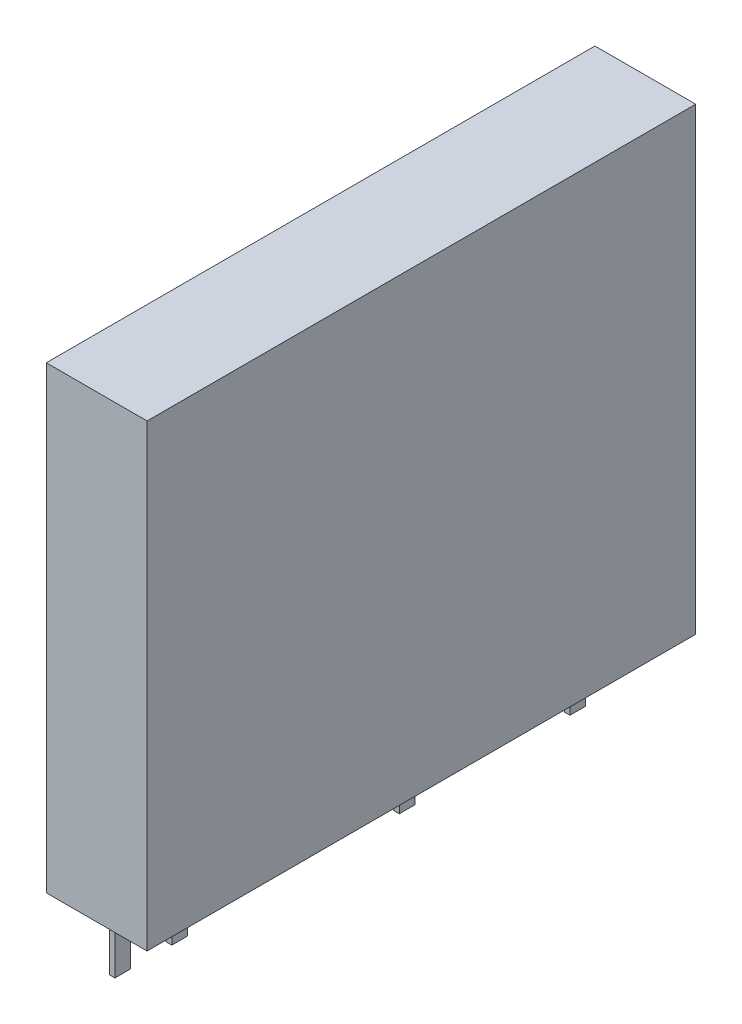
ISO-10303-21;
HEADER;
FILE_DESCRIPTION(('STEP AP214'),'2;1');
FILE_NAME('part.step','',(''),(''),'','','');
FILE_SCHEMA(('AUTOMOTIVE_DESIGN { 1 0 10303 214 1 1 1 1 }'));
ENDSEC;
DATA;
#1=APPLICATION_CONTEXT('core data for automotive mechanical design processes');
#2=APPLICATION_PROTOCOL_DEFINITION('international standard','automotive_design',2000,#1);
#3=PRODUCT_CONTEXT('',#1,'mechanical');
#4=PRODUCT('Part','Part','',(#3));
#5=PRODUCT_RELATED_PRODUCT_CATEGORY('part','',(#4));
#6=PRODUCT_DEFINITION_FORMATION('','',#4);
#7=PRODUCT_DEFINITION_CONTEXT('part definition',#1,'design');
#8=PRODUCT_DEFINITION('design','',#6,#7);
#9=PRODUCT_DEFINITION_SHAPE('','',#8);
#10=(LENGTH_UNIT() NAMED_UNIT(*) SI_UNIT(.MILLI.,.METRE.));
#11=(NAMED_UNIT(*) PLANE_ANGLE_UNIT() SI_UNIT($,.RADIAN.));
#12=(NAMED_UNIT(*) SI_UNIT($,.STERADIAN.) SOLID_ANGLE_UNIT());
#13=UNCERTAINTY_MEASURE_WITH_UNIT(LENGTH_MEASURE(1.E-05),#10,'distance_accuracy_value','');
#14=(GEOMETRIC_REPRESENTATION_CONTEXT(3) GLOBAL_UNCERTAINTY_ASSIGNED_CONTEXT((#13)) GLOBAL_UNIT_ASSIGNED_CONTEXT((#10,
#11,#12)) REPRESENTATION_CONTEXT('',''));
#15=CARTESIAN_POINT('',(0.,0.,0.));
#16=DIRECTION('',(0.,0.,1.));
#17=DIRECTION('',(1.,0.,0.));
#18=AXIS2_PLACEMENT_3D('',#15,#16,#17);
#19=CARTESIAN_POINT('',(4.5,-10.25,12.25));
#20=DIRECTION('',(0.,1.,0.));
#21=DIRECTION('',(0.,0.,1.));
#22=AXIS2_PLACEMENT_3D('',#19,#20,#21);
#23=PLANE('',#22);
#24=DIRECTION('',(0.,0.,-1.));
#25=VECTOR('',#24,1.);
#26=CARTESIAN_POINT('',(1.075,-10.25,-2.19000000000001));
#27=LINE('',#26,#25);
#28=CARTESIAN_POINT('',(1.075,-10.25,-2.19000000000001));
#29=VERTEX_POINT('',#28);
#30=CARTESIAN_POINT('',(1.075,-10.25,-2.89000000000001));
#31=VERTEX_POINT('',#30);
#32=EDGE_CURVE('E191',#29,#31,#27,.T.);
#33=ORIENTED_EDGE('',*,*,#32,.F.);
#34=DIRECTION('',(-1.,0.,0.));
#35=VECTOR('',#34,1.);
#36=CARTESIAN_POINT('',(1.325,-10.25,-2.19000000000001));
#37=LINE('',#36,#35);
#38=CARTESIAN_POINT('',(1.325,-10.25,-2.19000000000001));
#39=VERTEX_POINT('',#38);
#40=EDGE_CURVE('E204',#39,#29,#37,.T.);
#41=ORIENTED_EDGE('',*,*,#40,.F.);
#42=DIRECTION('',(0.,0.,1.));
#43=VECTOR('',#42,1.);
#44=CARTESIAN_POINT('',(1.325,-10.25,-2.19000000000001));
#45=LINE('',#44,#43);
#46=CARTESIAN_POINT('',(1.325,-10.25,-2.89000000000001));
#47=VERTEX_POINT('',#46);
#48=EDGE_CURVE('E213',#47,#39,#45,.T.);
#49=ORIENTED_EDGE('',*,*,#48,.F.);
#50=DIRECTION('',(1.,0.,0.));
#51=VECTOR('',#50,1.);
#52=CARTESIAN_POINT('',(1.325,-10.25,-2.89));
#53=LINE('',#52,#51);
#54=EDGE_CURVE('E194',#31,#47,#53,.T.);
#55=ORIENTED_EDGE('',*,*,#54,.F.);
#56=EDGE_LOOP('',(#33,#41,#49,#55));
#57=FACE_BOUND('',#56,.T.);
#58=DIRECTION('',(0.,0.,-1.));
#59=VECTOR('',#58,1.);
#60=CARTESIAN_POINT('',(1.075,-10.25,10.51));
#61=LINE('',#60,#59);
#62=CARTESIAN_POINT('',(1.075,-10.25,10.51));
#63=VERTEX_POINT('',#62);
#64=CARTESIAN_POINT('',(1.075,-10.25,9.81));
#65=VERTEX_POINT('',#64);
#66=EDGE_CURVE('E262',#63,#65,#61,.T.);
#67=ORIENTED_EDGE('',*,*,#66,.F.);
#68=DIRECTION('',(-1.,0.,0.));
#69=VECTOR('',#68,1.);
#70=CARTESIAN_POINT('',(1.325,-10.25,10.51));
#71=LINE('',#70,#69);
#72=CARTESIAN_POINT('',(1.325,-10.25,10.51));
#73=VERTEX_POINT('',#72);
#74=EDGE_CURVE('E267',#73,#63,#71,.T.);
#75=ORIENTED_EDGE('',*,*,#74,.F.);
#76=DIRECTION('',(0.,0.,1.));
#77=VECTOR('',#76,1.);
#78=CARTESIAN_POINT('',(1.325,-10.25,10.51));
#79=LINE('',#78,#77);
#80=CARTESIAN_POINT('',(1.325,-10.25,9.81));
#81=VERTEX_POINT('',#80);
#82=EDGE_CURVE('E279',#81,#73,#79,.T.);
#83=ORIENTED_EDGE('',*,*,#82,.F.);
#84=DIRECTION('',(1.,0.,0.));
#85=VECTOR('',#84,1.);
#86=CARTESIAN_POINT('',(1.325,-10.25,9.81));
#87=LINE('',#86,#85);
#88=EDGE_CURVE('E276',#65,#81,#87,.T.);
#89=ORIENTED_EDGE('',*,*,#88,.F.);
#90=EDGE_LOOP('',(#67,#75,#83,#89));
#91=FACE_BOUND('',#90,.T.);
#92=DIRECTION('',(0.,0.,-1.));
#93=VECTOR('',#92,1.);
#94=CARTESIAN_POINT('',(0.,-10.25,12.25));
#95=LINE('',#94,#93);
#96=CARTESIAN_POINT('',(0.,-10.25,12.25));
#97=VERTEX_POINT('',#96);
#98=CARTESIAN_POINT('',(0.,-10.25,-12.25));
#99=VERTEX_POINT('',#98);
#100=EDGE_CURVE('E300',#97,#99,#95,.T.);
#101=ORIENTED_EDGE('',*,*,#100,.T.);
#102=DIRECTION('',(-1.,0.,0.));
#103=VECTOR('',#102,1.);
#104=CARTESIAN_POINT('',(4.5,-10.25,-12.25));
#105=LINE('',#104,#103);
#106=CARTESIAN_POINT('',(4.5,-10.25,-12.25));
#107=VERTEX_POINT('',#106);
#108=EDGE_CURVE('E306',#107,#99,#105,.T.);
#109=ORIENTED_EDGE('',*,*,#108,.F.);
#110=DIRECTION('',(0.,0.,-1.));
#111=VECTOR('',#110,1.);
#112=CARTESIAN_POINT('',(4.5,-10.25,12.25));
#113=LINE('',#112,#111);
#114=CARTESIAN_POINT('',(4.5,-10.25,12.25));
#115=VERTEX_POINT('',#114);
#116=EDGE_CURVE('E304',#115,#107,#113,.T.);
#117=ORIENTED_EDGE('',*,*,#116,.F.);
#118=DIRECTION('',(-1.,0.,0.));
#119=VECTOR('',#118,1.);
#120=CARTESIAN_POINT('',(4.5,-10.25,12.25));
#121=LINE('',#120,#119);
#122=EDGE_CURVE('E316',#115,#97,#121,.T.);
#123=ORIENTED_EDGE('',*,*,#122,.T.);
#124=EDGE_LOOP('',(#101,#109,#117,#123));
#125=FACE_BOUND('',#124,.T.);
#126=DIRECTION('',(0.,0.,-1.));
#127=VECTOR('',#126,1.);
#128=CARTESIAN_POINT('',(1.075,-10.25,7.97));
#129=LINE('',#128,#127);
#130=CARTESIAN_POINT('',(1.075,-10.25,7.97));
#131=VERTEX_POINT('',#130);
#132=CARTESIAN_POINT('',(1.075,-10.25,7.27));
#133=VERTEX_POINT('',#132);
#134=EDGE_CURVE('E229',#131,#133,#129,.T.);
#135=ORIENTED_EDGE('',*,*,#134,.F.);
#136=DIRECTION('',(-1.,0.,0.));
#137=VECTOR('',#136,1.);
#138=CARTESIAN_POINT('',(1.325,-10.25,7.97));
#139=LINE('',#138,#137);
#140=CARTESIAN_POINT('',(1.325,-10.25,7.97));
#141=VERTEX_POINT('',#140);
#142=EDGE_CURVE('E234',#141,#131,#139,.T.);
#143=ORIENTED_EDGE('',*,*,#142,.F.);
#144=DIRECTION('',(0.,0.,1.));
#145=VECTOR('',#144,1.);
#146=CARTESIAN_POINT('',(1.325,-10.25,7.97));
#147=LINE('',#146,#145);
#148=CARTESIAN_POINT('',(1.325,-10.25,7.27));
#149=VERTEX_POINT('',#148);
#150=EDGE_CURVE('E246',#149,#141,#147,.T.);
#151=ORIENTED_EDGE('',*,*,#150,.F.);
#152=DIRECTION('',(1.,0.,0.));
#153=VECTOR('',#152,1.);
#154=CARTESIAN_POINT('',(1.325,-10.25,7.27));
#155=LINE('',#154,#153);
#156=EDGE_CURVE('E243',#133,#149,#155,.T.);
#157=ORIENTED_EDGE('',*,*,#156,.F.);
#158=EDGE_LOOP('',(#135,#143,#151,#157));
#159=FACE_BOUND('',#158,.T.);
#160=DIRECTION('',(0.,0.,-1.));
#161=VECTOR('',#160,1.);
#162=CARTESIAN_POINT('',(1.075,-10.25,-9.81));
#163=LINE('',#162,#161);
#164=CARTESIAN_POINT('',(1.075,-10.25,-9.81));
#165=VERTEX_POINT('',#164);
#166=CARTESIAN_POINT('',(1.075,-10.25,-10.51));
#167=VERTEX_POINT('',#166);
#168=EDGE_CURVE('E190',#165,#167,#163,.T.);
#169=ORIENTED_EDGE('',*,*,#168,.F.);
#170=DIRECTION('',(-1.,0.,0.));
#171=VECTOR('',#170,1.);
#172=CARTESIAN_POINT('',(1.325,-10.25,-9.81));
#173=LINE('',#172,#171);
#174=CARTESIAN_POINT('',(1.325,-10.25,-9.81));
#175=VERTEX_POINT('',#174);
#176=EDGE_CURVE('E187',#175,#165,#173,.T.);
#177=ORIENTED_EDGE('',*,*,#176,.F.);
#178=DIRECTION('',(0.,0.,1.));
#179=VECTOR('',#178,1.);
#180=CARTESIAN_POINT('',(1.325,-10.25,-9.81));
#181=LINE('',#180,#179);
#182=CARTESIAN_POINT('',(1.325,-10.25,-10.51));
#183=VERTEX_POINT('',#182);
#184=EDGE_CURVE('E53',#183,#175,#181,.T.);
#185=ORIENTED_EDGE('',*,*,#184,.F.);
#186=DIRECTION('',(1.,0.,0.));
#187=VECTOR('',#186,1.);
#188=CARTESIAN_POINT('',(1.325,-10.25,-10.51));
#189=LINE('',#188,#187);
#190=EDGE_CURVE('E48',#167,#183,#189,.T.);
#191=ORIENTED_EDGE('',*,*,#190,.F.);
#192=EDGE_LOOP('',(#169,#177,#185,#191));
#193=FACE_BOUND('',#192,.T.);
#194=ADVANCED_FACE('F33',(#57,#91,#125,#159,#193),#23,.F.);
#195=CARTESIAN_POINT('',(4.5,-10.25,-12.25));
#196=DIRECTION('',(0.,0.,1.));
#197=DIRECTION('',(1.,0.,0.));
#198=AXIS2_PLACEMENT_3D('',#195,#196,#197);
#199=PLANE('',#198);
#200=DIRECTION('',(0.,1.,0.));
#201=VECTOR('',#200,1.);
#202=CARTESIAN_POINT('',(0.,-10.25,-12.25));
#203=LINE('',#202,#201);
#204=CARTESIAN_POINT('',(0.,10.25,-12.25));
#205=VERTEX_POINT('',#204);
#206=EDGE_CURVE('E295',#99,#205,#203,.T.);
#207=ORIENTED_EDGE('',*,*,#206,.T.);
#208=DIRECTION('',(-1.,0.,0.));
#209=VECTOR('',#208,1.);
#210=CARTESIAN_POINT('',(4.5,10.25,-12.25));
#211=LINE('',#210,#209);
#212=CARTESIAN_POINT('',(4.5,10.25,-12.25));
#213=VERTEX_POINT('',#212);
#214=EDGE_CURVE('E11',#213,#205,#211,.T.);
#215=ORIENTED_EDGE('',*,*,#214,.F.);
#216=DIRECTION('',(0.,1.,0.));
#217=VECTOR('',#216,1.);
#218=CARTESIAN_POINT('',(4.5,-10.25,-12.25));
#219=LINE('',#218,#217);
#220=EDGE_CURVE('E296',#107,#213,#219,.T.);
#221=ORIENTED_EDGE('',*,*,#220,.F.);
#222=ORIENTED_EDGE('',*,*,#108,.T.);
#223=EDGE_LOOP('',(#207,#215,#221,#222));
#224=FACE_BOUND('',#223,.T.);
#225=ADVANCED_FACE('F35',(#224),#199,.F.);
#226=CARTESIAN_POINT('',(4.5,10.25,12.25));
#227=DIRECTION('',(0.,-1.,0.));
#228=DIRECTION('',(0.,0.,-1.));
#229=AXIS2_PLACEMENT_3D('',#226,#227,#228);
#230=PLANE('',#229);
#231=DIRECTION('',(0.,0.,1.));
#232=VECTOR('',#231,1.);
#233=CARTESIAN_POINT('',(0.,10.25,12.25));
#234=LINE('',#233,#232);
#235=CARTESIAN_POINT('',(0.,10.25,12.25));
#236=VERTEX_POINT('',#235);
#237=EDGE_CURVE('E309',#205,#236,#234,.T.);
#238=ORIENTED_EDGE('',*,*,#237,.T.);
#239=DIRECTION('',(-1.,0.,0.));
#240=VECTOR('',#239,1.);
#241=CARTESIAN_POINT('',(4.5,10.25,12.25));
#242=LINE('',#241,#240);
#243=CARTESIAN_POINT('',(4.5,10.25,12.25));
#244=VERTEX_POINT('',#243);
#245=EDGE_CURVE('E41',#244,#236,#242,.T.);
#246=ORIENTED_EDGE('',*,*,#245,.F.);
#247=DIRECTION('',(0.,0.,1.));
#248=VECTOR('',#247,1.);
#249=CARTESIAN_POINT('',(4.5,10.25,12.25));
#250=LINE('',#249,#248);
#251=EDGE_CURVE('E299',#213,#244,#250,.T.);
#252=ORIENTED_EDGE('',*,*,#251,.F.);
#253=ORIENTED_EDGE('',*,*,#214,.T.);
#254=EDGE_LOOP('',(#238,#246,#252,#253));
#255=FACE_BOUND('',#254,.T.);
#256=ADVANCED_FACE('F339',(#255),#230,.F.);
#257=CARTESIAN_POINT('',(4.5,-10.25,12.25));
#258=DIRECTION('',(0.,0.,-1.));
#259=DIRECTION('',(-1.,0.,0.));
#260=AXIS2_PLACEMENT_3D('',#257,#258,#259);
#261=PLANE('',#260);
#262=DIRECTION('',(0.,-1.,0.));
#263=VECTOR('',#262,1.);
#264=CARTESIAN_POINT('',(0.,-10.25,12.25));
#265=LINE('',#264,#263);
#266=EDGE_CURVE('E311',#236,#97,#265,.T.);
#267=ORIENTED_EDGE('',*,*,#266,.T.);
#268=ORIENTED_EDGE('',*,*,#122,.F.);
#269=DIRECTION('',(0.,-1.,0.));
#270=VECTOR('',#269,1.);
#271=CARTESIAN_POINT('',(4.5,-10.25,12.25));
#272=LINE('',#271,#270);
#273=EDGE_CURVE('E302',#244,#115,#272,.T.);
#274=ORIENTED_EDGE('',*,*,#273,.F.);
#275=ORIENTED_EDGE('',*,*,#245,.T.);
#276=EDGE_LOOP('',(#267,#268,#274,#275));
#277=FACE_BOUND('',#276,.T.);
#278=ADVANCED_FACE('F323',(#277),#261,.F.);
#279=CARTESIAN_POINT('',(4.5,0.,0.));
#280=DIRECTION('',(-1.,0.,0.));
#281=DIRECTION('',(0.,0.,1.));
#282=AXIS2_PLACEMENT_3D('',#279,#280,#281);
#283=PLANE('',#282);
#284=ORIENTED_EDGE('',*,*,#220,.T.);
#285=ORIENTED_EDGE('',*,*,#251,.T.);
#286=ORIENTED_EDGE('',*,*,#273,.T.);
#287=ORIENTED_EDGE('',*,*,#116,.T.);
#288=EDGE_LOOP('',(#284,#285,#286,#287));
#289=FACE_BOUND('',#288,.T.);
#290=ADVANCED_FACE('F338',(#289),#283,.F.);
#291=CARTESIAN_POINT('',(0.,0.,0.));
#292=DIRECTION('',(-1.,0.,0.));
#293=DIRECTION('',(0.,0.,1.));
#294=AXIS2_PLACEMENT_3D('',#291,#292,#293);
#295=PLANE('',#294);
#296=ORIENTED_EDGE('',*,*,#206,.F.);
#297=ORIENTED_EDGE('',*,*,#100,.F.);
#298=ORIENTED_EDGE('',*,*,#266,.F.);
#299=ORIENTED_EDGE('',*,*,#237,.F.);
#300=EDGE_LOOP('',(#296,#297,#298,#299));
#301=FACE_BOUND('',#300,.T.);
#302=ADVANCED_FACE('F329',(#301),#295,.T.);
#303=CARTESIAN_POINT('',(1.075,-13.75,10.51));
#304=DIRECTION('',(1.,0.,0.));
#305=DIRECTION('',(0.,0.,-1.));
#306=AXIS2_PLACEMENT_3D('',#303,#304,#305);
#307=PLANE('',#306);
#308=ORIENTED_EDGE('',*,*,#66,.T.);
#309=DIRECTION('',(0.,1.,0.));
#310=VECTOR('',#309,1.);
#311=CARTESIAN_POINT('',(1.075,-13.75,9.81));
#312=LINE('',#311,#310);
#313=CARTESIAN_POINT('',(1.075,-13.75,9.81));
#314=VERTEX_POINT('',#313);
#315=EDGE_CURVE('E292',#314,#65,#312,.T.);
#316=ORIENTED_EDGE('',*,*,#315,.F.);
#317=DIRECTION('',(0.,0.,-1.));
#318=VECTOR('',#317,1.);
#319=CARTESIAN_POINT('',(1.075,-13.75,10.51));
#320=LINE('',#319,#318);
#321=CARTESIAN_POINT('',(1.075,-13.75,10.51));
#322=VERTEX_POINT('',#321);
#323=EDGE_CURVE('E263',#322,#314,#320,.T.);
#324=ORIENTED_EDGE('',*,*,#323,.F.);
#325=DIRECTION('',(0.,1.,0.));
#326=VECTOR('',#325,1.);
#327=CARTESIAN_POINT('',(1.075,-13.75,10.51));
#328=LINE('',#327,#326);
#329=EDGE_CURVE('E273',#322,#63,#328,.T.);
#330=ORIENTED_EDGE('',*,*,#329,.T.);
#331=EDGE_LOOP('',(#308,#316,#324,#330));
#332=FACE_BOUND('',#331,.T.);
#333=ADVANCED_FACE('F355',(#332),#307,.F.);
#334=CARTESIAN_POINT('',(1.325,-13.75,9.81));
#335=DIRECTION('',(0.,0.,1.));
#336=DIRECTION('',(0.,-1.,0.));
#337=AXIS2_PLACEMENT_3D('',#334,#335,#336);
#338=PLANE('',#337);
#339=ORIENTED_EDGE('',*,*,#88,.T.);
#340=DIRECTION('',(0.,1.,0.));
#341=VECTOR('',#340,1.);
#342=CARTESIAN_POINT('',(1.325,-13.75,9.81));
#343=LINE('',#342,#341);
#344=CARTESIAN_POINT('',(1.325,-13.75,9.81));
#345=VERTEX_POINT('',#344);
#346=EDGE_CURVE('E289',#345,#81,#343,.T.);
#347=ORIENTED_EDGE('',*,*,#346,.F.);
#348=DIRECTION('',(1.,0.,0.));
#349=VECTOR('',#348,1.);
#350=CARTESIAN_POINT('',(1.325,-13.75,9.81));
#351=LINE('',#350,#349);
#352=EDGE_CURVE('E266',#314,#345,#351,.T.);
#353=ORIENTED_EDGE('',*,*,#352,.F.);
#354=ORIENTED_EDGE('',*,*,#315,.T.);
#355=EDGE_LOOP('',(#339,#347,#353,#354));
#356=FACE_BOUND('',#355,.T.);
#357=ADVANCED_FACE('F360',(#356),#338,.F.);
#358=CARTESIAN_POINT('',(1.325,-13.75,10.51));
#359=DIRECTION('',(-1.,0.,0.));
#360=DIRECTION('',(0.,0.,1.));
#361=AXIS2_PLACEMENT_3D('',#358,#359,#360);
#362=PLANE('',#361);
#363=ORIENTED_EDGE('',*,*,#82,.T.);
#364=DIRECTION('',(0.,1.,0.));
#365=VECTOR('',#364,1.);
#366=CARTESIAN_POINT('',(1.325,-13.75,10.51));
#367=LINE('',#366,#365);
#368=CARTESIAN_POINT('',(1.325,-13.75,10.51));
#369=VERTEX_POINT('',#368);
#370=EDGE_CURVE('E286',#369,#73,#367,.T.);
#371=ORIENTED_EDGE('',*,*,#370,.F.);
#372=DIRECTION('',(0.,0.,1.));
#373=VECTOR('',#372,1.);
#374=CARTESIAN_POINT('',(1.325,-13.75,10.51));
#375=LINE('',#374,#373);
#376=EDGE_CURVE('E269',#345,#369,#375,.T.);
#377=ORIENTED_EDGE('',*,*,#376,.F.);
#378=ORIENTED_EDGE('',*,*,#346,.T.);
#379=EDGE_LOOP('',(#363,#371,#377,#378));
#380=FACE_BOUND('',#379,.T.);
#381=ADVANCED_FACE('F364',(#380),#362,.F.);
#382=CARTESIAN_POINT('',(1.325,-13.75,10.51));
#383=DIRECTION('',(0.,0.,-1.));
#384=DIRECTION('',(-1.,0.,0.));
#385=AXIS2_PLACEMENT_3D('',#382,#383,#384);
#386=PLANE('',#385);
#387=ORIENTED_EDGE('',*,*,#74,.T.);
#388=ORIENTED_EDGE('',*,*,#329,.F.);
#389=DIRECTION('',(-1.,0.,0.));
#390=VECTOR('',#389,1.);
#391=CARTESIAN_POINT('',(1.325,-13.75,10.51));
#392=LINE('',#391,#390);
#393=EDGE_CURVE('E271',#369,#322,#392,.T.);
#394=ORIENTED_EDGE('',*,*,#393,.F.);
#395=ORIENTED_EDGE('',*,*,#370,.T.);
#396=EDGE_LOOP('',(#387,#388,#394,#395));
#397=FACE_BOUND('',#396,.T.);
#398=ADVANCED_FACE('F368',(#397),#386,.F.);
#399=CARTESIAN_POINT('',(0.,-13.75,0.));
#400=DIRECTION('',(0.,1.,0.));
#401=DIRECTION('',(0.,0.,1.));
#402=AXIS2_PLACEMENT_3D('',#399,#400,#401);
#403=PLANE('',#402);
#404=ORIENTED_EDGE('',*,*,#323,.T.);
#405=ORIENTED_EDGE('',*,*,#352,.T.);
#406=ORIENTED_EDGE('',*,*,#376,.T.);
#407=ORIENTED_EDGE('',*,*,#393,.T.);
#408=EDGE_LOOP('',(#404,#405,#406,#407));
#409=FACE_BOUND('',#408,.T.);
#410=ADVANCED_FACE('F372',(#409),#403,.F.);
#411=CARTESIAN_POINT('',(1.075,-13.75,7.97));
#412=DIRECTION('',(1.,0.,0.));
#413=DIRECTION('',(0.,0.,-1.));
#414=AXIS2_PLACEMENT_3D('',#411,#412,#413);
#415=PLANE('',#414);
#416=ORIENTED_EDGE('',*,*,#134,.T.);
#417=DIRECTION('',(0.,1.,0.));
#418=VECTOR('',#417,1.);
#419=CARTESIAN_POINT('',(1.075,-13.75,7.27));
#420=LINE('',#419,#418);
#421=CARTESIAN_POINT('',(1.075,-13.75,7.27));
#422=VERTEX_POINT('',#421);
#423=EDGE_CURVE('E259',#422,#133,#420,.T.);
#424=ORIENTED_EDGE('',*,*,#423,.F.);
#425=DIRECTION('',(0.,0.,-1.));
#426=VECTOR('',#425,1.);
#427=CARTESIAN_POINT('',(1.075,-13.75,7.97));
#428=LINE('',#427,#426);
#429=CARTESIAN_POINT('',(1.075,-13.75,7.97));
#430=VERTEX_POINT('',#429);
#431=EDGE_CURVE('E230',#430,#422,#428,.T.);
#432=ORIENTED_EDGE('',*,*,#431,.F.);
#433=DIRECTION('',(0.,1.,0.));
#434=VECTOR('',#433,1.);
#435=CARTESIAN_POINT('',(1.075,-13.75,7.97));
#436=LINE('',#435,#434);
#437=EDGE_CURVE('E240',#430,#131,#436,.T.);
#438=ORIENTED_EDGE('',*,*,#437,.T.);
#439=EDGE_LOOP('',(#416,#424,#432,#438));
#440=FACE_BOUND('',#439,.T.);
#441=ADVANCED_FACE('F376',(#440),#415,.F.);
#442=CARTESIAN_POINT('',(1.325,-13.75,7.27));
#443=DIRECTION('',(0.,0.,1.));
#444=DIRECTION('',(0.,-1.,0.));
#445=AXIS2_PLACEMENT_3D('',#442,#443,#444);
#446=PLANE('',#445);
#447=ORIENTED_EDGE('',*,*,#156,.T.);
#448=DIRECTION('',(0.,1.,0.));
#449=VECTOR('',#448,1.);
#450=CARTESIAN_POINT('',(1.325,-13.75,7.27));
#451=LINE('',#450,#449);
#452=CARTESIAN_POINT('',(1.325,-13.75,7.27));
#453=VERTEX_POINT('',#452);
#454=EDGE_CURVE('E256',#453,#149,#451,.T.);
#455=ORIENTED_EDGE('',*,*,#454,.F.);
#456=DIRECTION('',(1.,0.,0.));
#457=VECTOR('',#456,1.);
#458=CARTESIAN_POINT('',(1.325,-13.75,7.27));
#459=LINE('',#458,#457);
#460=EDGE_CURVE('E233',#422,#453,#459,.T.);
#461=ORIENTED_EDGE('',*,*,#460,.F.);
#462=ORIENTED_EDGE('',*,*,#423,.T.);
#463=EDGE_LOOP('',(#447,#455,#461,#462));
#464=FACE_BOUND('',#463,.T.);
#465=ADVANCED_FACE('F380',(#464),#446,.F.);
#466=CARTESIAN_POINT('',(1.325,-13.75,7.97));
#467=DIRECTION('',(-1.,0.,0.));
#468=DIRECTION('',(0.,0.,1.));
#469=AXIS2_PLACEMENT_3D('',#466,#467,#468);
#470=PLANE('',#469);
#471=ORIENTED_EDGE('',*,*,#150,.T.);
#472=DIRECTION('',(0.,1.,0.));
#473=VECTOR('',#472,1.);
#474=CARTESIAN_POINT('',(1.325,-13.75,7.97));
#475=LINE('',#474,#473);
#476=CARTESIAN_POINT('',(1.325,-13.75,7.97));
#477=VERTEX_POINT('',#476);
#478=EDGE_CURVE('E253',#477,#141,#475,.T.);
#479=ORIENTED_EDGE('',*,*,#478,.F.);
#480=DIRECTION('',(0.,0.,1.));
#481=VECTOR('',#480,1.);
#482=CARTESIAN_POINT('',(1.325,-13.75,7.97));
#483=LINE('',#482,#481);
#484=EDGE_CURVE('E236',#453,#477,#483,.T.);
#485=ORIENTED_EDGE('',*,*,#484,.F.);
#486=ORIENTED_EDGE('',*,*,#454,.T.);
#487=EDGE_LOOP('',(#471,#479,#485,#486));
#488=FACE_BOUND('',#487,.T.);
#489=ADVANCED_FACE('F384',(#488),#470,.F.);
#490=CARTESIAN_POINT('',(1.325,-13.75,7.97));
#491=DIRECTION('',(0.,0.,-1.));
#492=DIRECTION('',(-1.,0.,0.));
#493=AXIS2_PLACEMENT_3D('',#490,#491,#492);
#494=PLANE('',#493);
#495=ORIENTED_EDGE('',*,*,#142,.T.);
#496=ORIENTED_EDGE('',*,*,#437,.F.);
#497=DIRECTION('',(-1.,0.,0.));
#498=VECTOR('',#497,1.);
#499=CARTESIAN_POINT('',(1.325,-13.75,7.97));
#500=LINE('',#499,#498);
#501=EDGE_CURVE('E238',#477,#430,#500,.T.);
#502=ORIENTED_EDGE('',*,*,#501,.F.);
#503=ORIENTED_EDGE('',*,*,#478,.T.);
#504=EDGE_LOOP('',(#495,#496,#502,#503));
#505=FACE_BOUND('',#504,.T.);
#506=ADVANCED_FACE('F388',(#505),#494,.F.);
#507=CARTESIAN_POINT('',(0.,-13.75,0.));
#508=DIRECTION('',(0.,1.,0.));
#509=DIRECTION('',(0.,0.,1.));
#510=AXIS2_PLACEMENT_3D('',#507,#508,#509);
#511=PLANE('',#510);
#512=ORIENTED_EDGE('',*,*,#431,.T.);
#513=ORIENTED_EDGE('',*,*,#460,.T.);
#514=ORIENTED_EDGE('',*,*,#484,.T.);
#515=ORIENTED_EDGE('',*,*,#501,.T.);
#516=EDGE_LOOP('',(#512,#513,#514,#515));
#517=FACE_BOUND('',#516,.T.);
#518=ADVANCED_FACE('F392',(#517),#511,.F.);
#519=CARTESIAN_POINT('',(1.075,-13.75,-2.19000000000001));
#520=DIRECTION('',(1.,0.,0.));
#521=DIRECTION('',(0.,0.,-1.));
#522=AXIS2_PLACEMENT_3D('',#519,#520,#521);
#523=PLANE('',#522);
#524=ORIENTED_EDGE('',*,*,#32,.T.);
#525=DIRECTION('',(0.,1.,0.));
#526=VECTOR('',#525,1.);
#527=CARTESIAN_POINT('',(1.075,-13.75,-2.89000000000001));
#528=LINE('',#527,#526);
#529=CARTESIAN_POINT('',(1.075,-13.75,-2.89000000000001));
#530=VERTEX_POINT('',#529);
#531=EDGE_CURVE('E226',#530,#31,#528,.T.);
#532=ORIENTED_EDGE('',*,*,#531,.F.);
#533=DIRECTION('',(0.,0.,-1.));
#534=VECTOR('',#533,1.);
#535=CARTESIAN_POINT('',(1.075,-13.75,-2.19000000000001));
#536=LINE('',#535,#534);
#537=CARTESIAN_POINT('',(1.075,-13.75,-2.19000000000001));
#538=VERTEX_POINT('',#537);
#539=EDGE_CURVE('E200',#538,#530,#536,.T.);
#540=ORIENTED_EDGE('',*,*,#539,.F.);
#541=DIRECTION('',(0.,1.,0.));
#542=VECTOR('',#541,1.);
#543=CARTESIAN_POINT('',(1.075,-13.75,-2.19000000000001));
#544=LINE('',#543,#542);
#545=EDGE_CURVE('E209',#538,#29,#544,.T.);
#546=ORIENTED_EDGE('',*,*,#545,.T.);
#547=EDGE_LOOP('',(#524,#532,#540,#546));
#548=FACE_BOUND('',#547,.T.);
#549=ADVANCED_FACE('F396',(#548),#523,.F.);
#550=CARTESIAN_POINT('',(1.325,-13.75,-2.89000000000001));
#551=DIRECTION('',(0.,0.,1.));
#552=DIRECTION('',(1.,0.,0.));
#553=AXIS2_PLACEMENT_3D('',#550,#551,#552);
#554=PLANE('',#553);
#555=ORIENTED_EDGE('',*,*,#54,.T.);
#556=DIRECTION('',(0.,1.,0.));
#557=VECTOR('',#556,1.);
#558=CARTESIAN_POINT('',(1.325,-13.75,-2.89000000000001));
#559=LINE('',#558,#557);
#560=CARTESIAN_POINT('',(1.325,-13.75,-2.89000000000001));
#561=VERTEX_POINT('',#560);
#562=EDGE_CURVE('E223',#561,#47,#559,.T.);
#563=ORIENTED_EDGE('',*,*,#562,.F.);
#564=DIRECTION('',(1.,0.,0.));
#565=VECTOR('',#564,1.);
#566=CARTESIAN_POINT('',(1.325,-13.75,-2.89000000000001));
#567=LINE('',#566,#565);
#568=EDGE_CURVE('E203',#530,#561,#567,.T.);
#569=ORIENTED_EDGE('',*,*,#568,.F.);
#570=ORIENTED_EDGE('',*,*,#531,.T.);
#571=EDGE_LOOP('',(#555,#563,#569,#570));
#572=FACE_BOUND('',#571,.T.);
#573=ADVANCED_FACE('F400',(#572),#554,.F.);
#574=CARTESIAN_POINT('',(1.325,-13.75,-2.19000000000001));
#575=DIRECTION('',(-1.,0.,0.));
#576=DIRECTION('',(0.,0.,1.));
#577=AXIS2_PLACEMENT_3D('',#574,#575,#576);
#578=PLANE('',#577);
#579=ORIENTED_EDGE('',*,*,#48,.T.);
#580=DIRECTION('',(0.,1.,0.));
#581=VECTOR('',#580,1.);
#582=CARTESIAN_POINT('',(1.325,-13.75,-2.19000000000001));
#583=LINE('',#582,#581);
#584=CARTESIAN_POINT('',(1.325,-13.75,-2.19000000000001));
#585=VERTEX_POINT('',#584);
#586=EDGE_CURVE('E220',#585,#39,#583,.T.);
#587=ORIENTED_EDGE('',*,*,#586,.F.);
#588=DIRECTION('',(0.,0.,1.));
#589=VECTOR('',#588,1.);
#590=CARTESIAN_POINT('',(1.325,-13.75,-2.19000000000001));
#591=LINE('',#590,#589);
#592=EDGE_CURVE('E206',#561,#585,#591,.T.);
#593=ORIENTED_EDGE('',*,*,#592,.F.);
#594=ORIENTED_EDGE('',*,*,#562,.T.);
#595=EDGE_LOOP('',(#579,#587,#593,#594));
#596=FACE_BOUND('',#595,.T.);
#597=ADVANCED_FACE('F404',(#596),#578,.F.);
#598=CARTESIAN_POINT('',(1.325,-13.75,-2.19000000000001));
#599=DIRECTION('',(0.,0.,-1.));
#600=DIRECTION('',(0.,1.,0.));
#601=AXIS2_PLACEMENT_3D('',#598,#599,#600);
#602=PLANE('',#601);
#603=ORIENTED_EDGE('',*,*,#40,.T.);
#604=ORIENTED_EDGE('',*,*,#545,.F.);
#605=DIRECTION('',(-1.,0.,0.));
#606=VECTOR('',#605,1.);
#607=CARTESIAN_POINT('',(1.325,-13.75,-2.19000000000001));
#608=LINE('',#607,#606);
#609=EDGE_CURVE('E208',#585,#538,#608,.T.);
#610=ORIENTED_EDGE('',*,*,#609,.F.);
#611=ORIENTED_EDGE('',*,*,#586,.T.);
#612=EDGE_LOOP('',(#603,#604,#610,#611));
#613=FACE_BOUND('',#612,.T.);
#614=ADVANCED_FACE('F408',(#613),#602,.F.);
#615=CARTESIAN_POINT('',(0.,-13.75,0.));
#616=DIRECTION('',(0.,1.,0.));
#617=DIRECTION('',(0.,0.,1.));
#618=AXIS2_PLACEMENT_3D('',#615,#616,#617);
#619=PLANE('',#618);
#620=ORIENTED_EDGE('',*,*,#539,.T.);
#621=ORIENTED_EDGE('',*,*,#568,.T.);
#622=ORIENTED_EDGE('',*,*,#592,.T.);
#623=ORIENTED_EDGE('',*,*,#609,.T.);
#624=EDGE_LOOP('',(#620,#621,#622,#623));
#625=FACE_BOUND('',#624,.T.);
#626=ADVANCED_FACE('F412',(#625),#619,.F.);
#627=CARTESIAN_POINT('',(1.075,-13.75,-9.81));
#628=DIRECTION('',(1.,0.,0.));
#629=DIRECTION('',(0.,0.,-1.));
#630=AXIS2_PLACEMENT_3D('',#627,#628,#629);
#631=PLANE('',#630);
#632=ORIENTED_EDGE('',*,*,#168,.T.);
#633=DIRECTION('',(0.,1.,0.));
#634=VECTOR('',#633,1.);
#635=CARTESIAN_POINT('',(1.075,-13.75,-10.51));
#636=LINE('',#635,#634);
#637=CARTESIAN_POINT('',(1.075,-13.75,-10.51));
#638=VERTEX_POINT('',#637);
#639=EDGE_CURVE('E171',#638,#167,#636,.T.);
#640=ORIENTED_EDGE('',*,*,#639,.F.);
#641=DIRECTION('',(0.,0.,-1.));
#642=VECTOR('',#641,1.);
#643=CARTESIAN_POINT('',(1.075,-13.75,-9.81));
#644=LINE('',#643,#642);
#645=CARTESIAN_POINT('',(1.075,-13.75,-9.81));
#646=VERTEX_POINT('',#645);
#647=EDGE_CURVE('E178',#646,#638,#644,.T.);
#648=ORIENTED_EDGE('',*,*,#647,.F.);
#649=DIRECTION('',(0.,1.,0.));
#650=VECTOR('',#649,1.);
#651=CARTESIAN_POINT('',(1.075,-13.75,-9.81));
#652=LINE('',#651,#650);
#653=EDGE_CURVE('E584',#646,#165,#652,.T.);
#654=ORIENTED_EDGE('',*,*,#653,.T.);
#655=EDGE_LOOP('',(#632,#640,#648,#654));
#656=FACE_BOUND('',#655,.T.);
#657=ADVANCED_FACE('F189',(#656),#631,.F.);
#658=CARTESIAN_POINT('',(1.325,-13.75,-10.51));
#659=DIRECTION('',(0.,0.,1.));
#660=DIRECTION('',(1.,0.,0.));
#661=AXIS2_PLACEMENT_3D('',#658,#659,#660);
#662=PLANE('',#661);
#663=ORIENTED_EDGE('',*,*,#190,.T.);
#664=DIRECTION('',(0.,1.,0.));
#665=VECTOR('',#664,1.);
#666=CARTESIAN_POINT('',(1.325,-13.75,-10.51));
#667=LINE('',#666,#665);
#668=CARTESIAN_POINT('',(1.325,-13.75,-10.51));
#669=VERTEX_POINT('',#668);
#670=EDGE_CURVE('E174',#669,#183,#667,.T.);
#671=ORIENTED_EDGE('',*,*,#670,.F.);
#672=DIRECTION('',(1.,0.,0.));
#673=VECTOR('',#672,1.);
#674=CARTESIAN_POINT('',(1.325,-13.75,-10.51));
#675=LINE('',#674,#673);
#676=EDGE_CURVE('E167',#638,#669,#675,.T.);
#677=ORIENTED_EDGE('',*,*,#676,.F.);
#678=ORIENTED_EDGE('',*,*,#639,.T.);
#679=EDGE_LOOP('',(#663,#671,#677,#678));
#680=FACE_BOUND('',#679,.T.);
#681=ADVANCED_FACE('F169',(#680),#662,.F.);
#682=CARTESIAN_POINT('',(1.325,-13.75,-9.81));
#683=DIRECTION('',(-1.,0.,0.));
#684=DIRECTION('',(0.,0.,1.));
#685=AXIS2_PLACEMENT_3D('',#682,#683,#684);
#686=PLANE('',#685);
#687=ORIENTED_EDGE('',*,*,#184,.T.);
#688=DIRECTION('',(0.,1.,0.));
#689=VECTOR('',#688,1.);
#690=CARTESIAN_POINT('',(1.325,-13.75,-9.81));
#691=LINE('',#690,#689);
#692=CARTESIAN_POINT('',(1.325,-13.75,-9.81));
#693=VERTEX_POINT('',#692);
#694=EDGE_CURVE('E196',#693,#175,#691,.T.);
#695=ORIENTED_EDGE('',*,*,#694,.F.);
#696=DIRECTION('',(0.,0.,1.));
#697=VECTOR('',#696,1.);
#698=CARTESIAN_POINT('',(1.325,-13.75,-9.81));
#699=LINE('',#698,#697);
#700=EDGE_CURVE('E177',#669,#693,#699,.T.);
#701=ORIENTED_EDGE('',*,*,#700,.F.);
#702=ORIENTED_EDGE('',*,*,#670,.T.);
#703=EDGE_LOOP('',(#687,#695,#701,#702));
#704=FACE_BOUND('',#703,.T.);
#705=ADVANCED_FACE('F421',(#704),#686,.F.);
#706=CARTESIAN_POINT('',(1.325,-13.75,-9.81));
#707=DIRECTION('',(0.,0.,-1.));
#708=DIRECTION('',(-1.,0.,0.));
#709=AXIS2_PLACEMENT_3D('',#706,#707,#708);
#710=PLANE('',#709);
#711=ORIENTED_EDGE('',*,*,#176,.T.);
#712=ORIENTED_EDGE('',*,*,#653,.F.);
#713=DIRECTION('',(-1.,0.,0.));
#714=VECTOR('',#713,1.);
#715=CARTESIAN_POINT('',(1.325,-13.75,-9.81));
#716=LINE('',#715,#714);
#717=EDGE_CURVE('E183',#693,#646,#716,.T.);
#718=ORIENTED_EDGE('',*,*,#717,.F.);
#719=ORIENTED_EDGE('',*,*,#694,.T.);
#720=EDGE_LOOP('',(#711,#712,#718,#719));
#721=FACE_BOUND('',#720,.T.);
#722=ADVANCED_FACE('F424',(#721),#710,.F.);
#723=CARTESIAN_POINT('',(0.,-13.75,0.));
#724=DIRECTION('',(0.,1.,0.));
#725=DIRECTION('',(0.,0.,1.));
#726=AXIS2_PLACEMENT_3D('',#723,#724,#725);
#727=PLANE('',#726);
#728=ORIENTED_EDGE('',*,*,#647,.T.);
#729=ORIENTED_EDGE('',*,*,#676,.T.);
#730=ORIENTED_EDGE('',*,*,#700,.T.);
#731=ORIENTED_EDGE('',*,*,#717,.T.);
#732=EDGE_LOOP('',(#728,#729,#730,#731));
#733=FACE_BOUND('',#732,.T.);
#734=ADVANCED_FACE('F181',(#733),#727,.F.);
#735=CLOSED_SHELL('',(#194,#225,#256,#278,#290,#302,#333,#357,#381,#398,#410,#441,#465,#489,
#506,#518,#549,#573,#597,#614,#626,#657,#681,#705,#722,#734));
#736=MANIFOLD_SOLID_BREP('B2',#735);
#737=ADVANCED_BREP_SHAPE_REPRESENTATION('',(#18,#736),#14);
#738=SHAPE_DEFINITION_REPRESENTATION(#9,#737);
ENDSEC;
END-ISO-10303-21;
